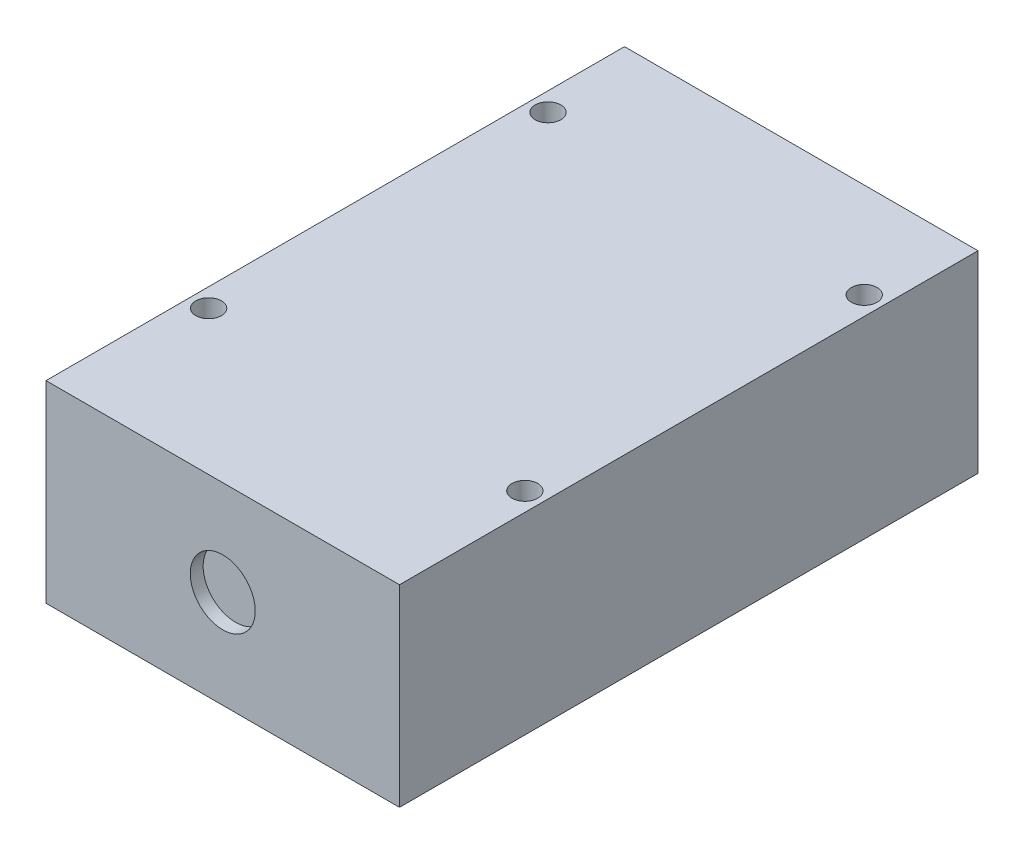
ISO-10303-21;
HEADER;
FILE_DESCRIPTION(('STEP AP214'),'2;1');
FILE_NAME('part.step','',(''),(''),'','','');
FILE_SCHEMA(('AUTOMOTIVE_DESIGN { 1 0 10303 214 1 1 1 1 }'));
ENDSEC;
DATA;
#1=APPLICATION_CONTEXT('core data for automotive mechanical design processes');
#2=APPLICATION_PROTOCOL_DEFINITION('international standard','automotive_design',2000,#1);
#3=PRODUCT_CONTEXT('',#1,'mechanical');
#4=PRODUCT('Part','Part','',(#3));
#5=PRODUCT_RELATED_PRODUCT_CATEGORY('part','',(#4));
#6=PRODUCT_DEFINITION_FORMATION('','',#4);
#7=PRODUCT_DEFINITION_CONTEXT('part definition',#1,'design');
#8=PRODUCT_DEFINITION('design','',#6,#7);
#9=PRODUCT_DEFINITION_SHAPE('','',#8);
#10=(LENGTH_UNIT() NAMED_UNIT(*) SI_UNIT(.MILLI.,.METRE.));
#11=(NAMED_UNIT(*) PLANE_ANGLE_UNIT() SI_UNIT($,.RADIAN.));
#12=(NAMED_UNIT(*) SI_UNIT($,.STERADIAN.) SOLID_ANGLE_UNIT());
#13=UNCERTAINTY_MEASURE_WITH_UNIT(LENGTH_MEASURE(1.E-05),#10,'distance_accuracy_value','');
#14=(GEOMETRIC_REPRESENTATION_CONTEXT(3) GLOBAL_UNCERTAINTY_ASSIGNED_CONTEXT((#13)) GLOBAL_UNIT_ASSIGNED_CONTEXT((#10,
#11,#12)) REPRESENTATION_CONTEXT('',''));
#15=CARTESIAN_POINT('',(0.,0.,0.));
#16=DIRECTION('',(0.,0.,1.));
#17=DIRECTION('',(1.,0.,0.));
#18=AXIS2_PLACEMENT_3D('',#15,#16,#17);
#19=CARTESIAN_POINT('',(0.,15.,0.));
#20=DIRECTION('',(0.,1.,0.));
#21=DIRECTION('',(0.,0.,1.));
#22=AXIS2_PLACEMENT_3D('',#19,#20,#21);
#23=PLANE('',#22);
#24=CARTESIAN_POINT('',(12.3,15.,11.3));
#25=DIRECTION('',(0.,1.,0.));
#26=DIRECTION('',(0.,0.,1.));
#27=AXIS2_PLACEMENT_3D('',#24,#25,#26);
#28=CIRCLE('',#27,1.);
#29=CARTESIAN_POINT('',(12.3,15.,12.3));
#30=VERTEX_POINT('',#29);
#31=EDGE_CURVE('E131',#30,#30,#28,.T.);
#32=ORIENTED_EDGE('',*,*,#31,.F.);
#33=EDGE_LOOP('',(#32));
#34=FACE_BOUND('',#33,.T.);
#35=CARTESIAN_POINT('',(-12.3,15.,-15.1));
#36=DIRECTION('',(0.,1.,0.));
#37=DIRECTION('',(0.,0.,1.));
#38=AXIS2_PLACEMENT_3D('',#35,#36,#37);
#39=CIRCLE('',#38,1.);
#40=CARTESIAN_POINT('',(-12.3,15.,-14.1));
#41=VERTEX_POINT('',#40);
#42=EDGE_CURVE('E110',#41,#41,#39,.T.);
#43=ORIENTED_EDGE('',*,*,#42,.F.);
#44=EDGE_LOOP('',(#43));
#45=FACE_BOUND('',#44,.T.);
#46=DIRECTION('',(0.,0.,-1.));
#47=VECTOR('',#46,1.);
#48=CARTESIAN_POINT('',(13.75,15.,-22.5));
#49=LINE('',#48,#47);
#50=CARTESIAN_POINT('',(13.75,15.,22.5));
#51=VERTEX_POINT('',#50);
#52=CARTESIAN_POINT('',(13.75,15.,-22.5));
#53=VERTEX_POINT('',#52);
#54=EDGE_CURVE('E95',#51,#53,#49,.T.);
#55=ORIENTED_EDGE('',*,*,#54,.T.);
#56=DIRECTION('',(-1.,0.,0.));
#57=VECTOR('',#56,1.);
#58=CARTESIAN_POINT('',(-13.75,15.,-22.5));
#59=LINE('',#58,#57);
#60=CARTESIAN_POINT('',(-13.75,15.,-22.5));
#61=VERTEX_POINT('',#60);
#62=EDGE_CURVE('E90',#53,#61,#59,.T.);
#63=ORIENTED_EDGE('',*,*,#62,.T.);
#64=DIRECTION('',(0.,0.,1.));
#65=VECTOR('',#64,1.);
#66=CARTESIAN_POINT('',(-13.75,15.,-22.5));
#67=LINE('',#66,#65);
#68=CARTESIAN_POINT('',(-13.75,15.,22.5));
#69=VERTEX_POINT('',#68);
#70=EDGE_CURVE('E93',#61,#69,#67,.T.);
#71=ORIENTED_EDGE('',*,*,#70,.T.);
#72=DIRECTION('',(1.,0.,0.));
#73=VECTOR('',#72,1.);
#74=CARTESIAN_POINT('',(-13.75,15.,22.5));
#75=LINE('',#74,#73);
#76=EDGE_CURVE('E60',#69,#51,#75,.T.);
#77=ORIENTED_EDGE('',*,*,#76,.T.);
#78=EDGE_LOOP('',(#55,#63,#71,#77));
#79=FACE_BOUND('',#78,.T.);
#80=CARTESIAN_POINT('',(12.3,15.,-15.1));
#81=DIRECTION('',(0.,1.,0.));
#82=DIRECTION('',(0.,0.,1.));
#83=AXIS2_PLACEMENT_3D('',#80,#81,#82);
#84=CIRCLE('',#83,1.);
#85=CARTESIAN_POINT('',(12.3,15.,-14.1));
#86=VERTEX_POINT('',#85);
#87=EDGE_CURVE('E125',#86,#86,#84,.T.);
#88=ORIENTED_EDGE('',*,*,#87,.F.);
#89=EDGE_LOOP('',(#88));
#90=FACE_BOUND('',#89,.T.);
#91=CARTESIAN_POINT('',(-12.3,15.,11.3));
#92=DIRECTION('',(0.,1.,0.));
#93=DIRECTION('',(0.,0.,1.));
#94=AXIS2_PLACEMENT_3D('',#91,#92,#93);
#95=CIRCLE('',#94,1.);
#96=CARTESIAN_POINT('',(-12.3,15.,12.3));
#97=VERTEX_POINT('',#96);
#98=EDGE_CURVE('E137',#97,#97,#95,.T.);
#99=ORIENTED_EDGE('',*,*,#98,.F.);
#100=EDGE_LOOP('',(#99));
#101=FACE_BOUND('',#100,.T.);
#102=ADVANCED_FACE('F43',(#34,#45,#79,#90,#101),#23,.T.);
#103=CARTESIAN_POINT('',(0.,0.,0.));
#104=DIRECTION('',(0.,1.,0.));
#105=DIRECTION('',(0.,0.,1.));
#106=AXIS2_PLACEMENT_3D('',#103,#104,#105);
#107=PLANE('',#106);
#108=DIRECTION('',(0.,0.,-1.));
#109=VECTOR('',#108,1.);
#110=CARTESIAN_POINT('',(13.75,0.,-22.5));
#111=LINE('',#110,#109);
#112=CARTESIAN_POINT('',(13.75,0.,22.5));
#113=VERTEX_POINT('',#112);
#114=CARTESIAN_POINT('',(13.75,0.,-22.5));
#115=VERTEX_POINT('',#114);
#116=EDGE_CURVE('E107',#113,#115,#111,.T.);
#117=ORIENTED_EDGE('',*,*,#116,.F.);
#118=DIRECTION('',(1.,0.,0.));
#119=VECTOR('',#118,1.);
#120=CARTESIAN_POINT('',(-13.75,0.,22.5));
#121=LINE('',#120,#119);
#122=CARTESIAN_POINT('',(-13.75,0.,22.5));
#123=VERTEX_POINT('',#122);
#124=EDGE_CURVE('E83',#123,#113,#121,.T.);
#125=ORIENTED_EDGE('',*,*,#124,.F.);
#126=DIRECTION('',(0.,0.,1.));
#127=VECTOR('',#126,1.);
#128=CARTESIAN_POINT('',(-13.75,0.,-22.5));
#129=LINE('',#128,#127);
#130=CARTESIAN_POINT('',(-13.75,0.,-22.5));
#131=VERTEX_POINT('',#130);
#132=EDGE_CURVE('E77',#131,#123,#129,.T.);
#133=ORIENTED_EDGE('',*,*,#132,.F.);
#134=DIRECTION('',(-1.,0.,0.));
#135=VECTOR('',#134,1.);
#136=CARTESIAN_POINT('',(-13.75,0.,-22.5));
#137=LINE('',#136,#135);
#138=EDGE_CURVE('E99',#115,#131,#137,.T.);
#139=ORIENTED_EDGE('',*,*,#138,.F.);
#140=EDGE_LOOP('',(#117,#125,#133,#139));
#141=FACE_BOUND('',#140,.T.);
#142=CARTESIAN_POINT('',(-12.3,0.,-15.1));
#143=DIRECTION('',(0.,1.,0.));
#144=DIRECTION('',(0.,0.,1.));
#145=AXIS2_PLACEMENT_3D('',#142,#143,#144);
#146=CIRCLE('',#145,1.);
#147=CARTESIAN_POINT('',(-12.3,0.,-14.1));
#148=VERTEX_POINT('',#147);
#149=EDGE_CURVE('E122',#148,#148,#146,.T.);
#150=ORIENTED_EDGE('',*,*,#149,.T.);
#151=EDGE_LOOP('',(#150));
#152=FACE_BOUND('',#151,.T.);
#153=CARTESIAN_POINT('',(12.3,0.,-15.1));
#154=DIRECTION('',(0.,1.,0.));
#155=DIRECTION('',(0.,0.,1.));
#156=AXIS2_PLACEMENT_3D('',#153,#154,#155);
#157=CIRCLE('',#156,1.);
#158=CARTESIAN_POINT('',(12.3,0.,-14.1));
#159=VERTEX_POINT('',#158);
#160=EDGE_CURVE('E128',#159,#159,#157,.T.);
#161=ORIENTED_EDGE('',*,*,#160,.T.);
#162=EDGE_LOOP('',(#161));
#163=FACE_BOUND('',#162,.T.);
#164=CARTESIAN_POINT('',(12.3,0.,11.3));
#165=DIRECTION('',(0.,1.,0.));
#166=DIRECTION('',(0.,0.,1.));
#167=AXIS2_PLACEMENT_3D('',#164,#165,#166);
#168=CIRCLE('',#167,1.);
#169=CARTESIAN_POINT('',(12.3,0.,12.3));
#170=VERTEX_POINT('',#169);
#171=EDGE_CURVE('E134',#170,#170,#168,.T.);
#172=ORIENTED_EDGE('',*,*,#171,.T.);
#173=EDGE_LOOP('',(#172));
#174=FACE_BOUND('',#173,.T.);
#175=CARTESIAN_POINT('',(-12.3,0.,11.3));
#176=DIRECTION('',(0.,1.,0.));
#177=DIRECTION('',(0.,0.,1.));
#178=AXIS2_PLACEMENT_3D('',#175,#176,#177);
#179=CIRCLE('',#178,1.);
#180=CARTESIAN_POINT('',(-12.3,0.,12.3));
#181=VERTEX_POINT('',#180);
#182=EDGE_CURVE('E140',#181,#181,#179,.T.);
#183=ORIENTED_EDGE('',*,*,#182,.T.);
#184=EDGE_LOOP('',(#183));
#185=FACE_BOUND('',#184,.T.);
#186=ADVANCED_FACE('F118',(#141,#152,#163,#174,#185),#107,.F.);
#187=CARTESIAN_POINT('',(13.75,15.,-22.5));
#188=DIRECTION('',(-1.,0.,0.));
#189=DIRECTION('',(0.,0.,1.));
#190=AXIS2_PLACEMENT_3D('',#187,#188,#189);
#191=PLANE('',#190);
#192=ORIENTED_EDGE('',*,*,#116,.T.);
#193=DIRECTION('',(0.,-1.,0.));
#194=VECTOR('',#193,1.);
#195=CARTESIAN_POINT('',(13.75,15.,-22.5));
#196=LINE('',#195,#194);
#197=EDGE_CURVE('E11',#53,#115,#196,.T.);
#198=ORIENTED_EDGE('',*,*,#197,.F.);
#199=ORIENTED_EDGE('',*,*,#54,.F.);
#200=DIRECTION('',(0.,-1.,0.));
#201=VECTOR('',#200,1.);
#202=CARTESIAN_POINT('',(13.75,15.,22.5));
#203=LINE('',#202,#201);
#204=EDGE_CURVE('E103',#51,#113,#203,.T.);
#205=ORIENTED_EDGE('',*,*,#204,.T.);
#206=EDGE_LOOP('',(#192,#198,#199,#205));
#207=FACE_BOUND('',#206,.T.);
#208=ADVANCED_FACE('F45',(#207),#191,.F.);
#209=CARTESIAN_POINT('',(-13.75,15.,-22.5));
#210=DIRECTION('',(0.,0.,1.));
#211=DIRECTION('',(1.,0.,0.));
#212=AXIS2_PLACEMENT_3D('',#209,#210,#211);
#213=PLANE('',#212);
#214=ORIENTED_EDGE('',*,*,#138,.T.);
#215=DIRECTION('',(0.,-1.,0.));
#216=VECTOR('',#215,1.);
#217=CARTESIAN_POINT('',(-13.75,15.,-22.5));
#218=LINE('',#217,#216);
#219=EDGE_CURVE('E52',#61,#131,#218,.T.);
#220=ORIENTED_EDGE('',*,*,#219,.F.);
#221=ORIENTED_EDGE('',*,*,#62,.F.);
#222=ORIENTED_EDGE('',*,*,#197,.T.);
#223=EDGE_LOOP('',(#214,#220,#221,#222));
#224=FACE_BOUND('',#223,.T.);
#225=ADVANCED_FACE('F98',(#224),#213,.F.);
#226=CARTESIAN_POINT('',(-13.75,15.,-22.5));
#227=DIRECTION('',(1.,0.,0.));
#228=DIRECTION('',(0.,0.,-1.));
#229=AXIS2_PLACEMENT_3D('',#226,#227,#228);
#230=PLANE('',#229);
#231=ORIENTED_EDGE('',*,*,#132,.T.);
#232=DIRECTION('',(0.,-1.,0.));
#233=VECTOR('',#232,1.);
#234=CARTESIAN_POINT('',(-13.75,15.,22.5));
#235=LINE('',#234,#233);
#236=EDGE_CURVE('E100',#69,#123,#235,.T.);
#237=ORIENTED_EDGE('',*,*,#236,.F.);
#238=ORIENTED_EDGE('',*,*,#70,.F.);
#239=ORIENTED_EDGE('',*,*,#219,.T.);
#240=EDGE_LOOP('',(#231,#237,#238,#239));
#241=FACE_BOUND('',#240,.T.);
#242=ADVANCED_FACE('F101',(#241),#230,.F.);
#243=CARTESIAN_POINT('',(-13.75,15.,22.5));
#244=DIRECTION('',(0.,0.,-1.));
#245=DIRECTION('',(-1.,0.,0.));
#246=AXIS2_PLACEMENT_3D('',#243,#244,#245);
#247=PLANE('',#246);
#248=CARTESIAN_POINT('',(0.,7.61486871513089,22.5));
#249=DIRECTION('',(0.,0.,1.));
#250=DIRECTION('',(1.,0.,0.));
#251=AXIS2_PLACEMENT_3D('',#248,#249,#250);
#252=CIRCLE('',#251,2.52645656466927);
#253=CARTESIAN_POINT('',(2.52645656466927,7.61486871513089,22.5));
#254=VERTEX_POINT('',#253);
#255=EDGE_CURVE('E146',#254,#254,#252,.T.);
#256=ORIENTED_EDGE('',*,*,#255,.F.);
#257=EDGE_LOOP('',(#256));
#258=FACE_BOUND('',#257,.T.);
#259=ORIENTED_EDGE('',*,*,#124,.T.);
#260=ORIENTED_EDGE('',*,*,#204,.F.);
#261=ORIENTED_EDGE('',*,*,#76,.F.);
#262=ORIENTED_EDGE('',*,*,#236,.T.);
#263=EDGE_LOOP('',(#259,#260,#261,#262));
#264=FACE_BOUND('',#263,.T.);
#265=ADVANCED_FACE('F115',(#258,#264),#247,.F.);
#266=CARTESIAN_POINT('',(-12.3,15.,-15.1));
#267=DIRECTION('',(0.,-1.,0.));
#268=DIRECTION('',(0.,0.,-1.));
#269=AXIS2_PLACEMENT_3D('',#266,#267,#268);
#270=CYLINDRICAL_SURFACE('',#269,1.);
#271=ORIENTED_EDGE('',*,*,#42,.T.);
#272=EDGE_LOOP('',(#271));
#273=FACE_BOUND('',#272,.T.);
#274=ORIENTED_EDGE('',*,*,#149,.F.);
#275=EDGE_LOOP('',(#274));
#276=FACE_BOUND('',#275,.T.);
#277=ADVANCED_FACE('F162',(#273,#276),#270,.F.);
#278=CARTESIAN_POINT('',(12.3,15.,-15.1));
#279=DIRECTION('',(0.,-1.,0.));
#280=DIRECTION('',(0.,0.,-1.));
#281=AXIS2_PLACEMENT_3D('',#278,#279,#280);
#282=CYLINDRICAL_SURFACE('',#281,1.);
#283=ORIENTED_EDGE('',*,*,#87,.T.);
#284=EDGE_LOOP('',(#283));
#285=FACE_BOUND('',#284,.T.);
#286=ORIENTED_EDGE('',*,*,#160,.F.);
#287=EDGE_LOOP('',(#286));
#288=FACE_BOUND('',#287,.T.);
#289=ADVANCED_FACE('F168',(#285,#288),#282,.F.);
#290=CARTESIAN_POINT('',(12.3,15.,11.3));
#291=DIRECTION('',(0.,-1.,0.));
#292=DIRECTION('',(0.,0.,-1.));
#293=AXIS2_PLACEMENT_3D('',#290,#291,#292);
#294=CYLINDRICAL_SURFACE('',#293,1.);
#295=ORIENTED_EDGE('',*,*,#31,.T.);
#296=EDGE_LOOP('',(#295));
#297=FACE_BOUND('',#296,.T.);
#298=ORIENTED_EDGE('',*,*,#171,.F.);
#299=EDGE_LOOP('',(#298));
#300=FACE_BOUND('',#299,.T.);
#301=ADVANCED_FACE('F185',(#297,#300),#294,.F.);
#302=CARTESIAN_POINT('',(-12.3,15.,11.3));
#303=DIRECTION('',(0.,-1.,0.));
#304=DIRECTION('',(0.,0.,-1.));
#305=AXIS2_PLACEMENT_3D('',#302,#303,#304);
#306=CYLINDRICAL_SURFACE('',#305,1.);
#307=ORIENTED_EDGE('',*,*,#98,.T.);
#308=EDGE_LOOP('',(#307));
#309=FACE_BOUND('',#308,.T.);
#310=ORIENTED_EDGE('',*,*,#182,.F.);
#311=EDGE_LOOP('',(#310));
#312=FACE_BOUND('',#311,.T.);
#313=ADVANCED_FACE('F157',(#309,#312),#306,.F.);
#314=CARTESIAN_POINT('',(0.,7.61486871513089,21.5));
#315=DIRECTION('',(0.,0.,1.));
#316=DIRECTION('',(1.,0.,0.));
#317=AXIS2_PLACEMENT_3D('',#314,#315,#316);
#318=CYLINDRICAL_SURFACE('',#317,2.52645656466927);
#319=CARTESIAN_POINT('',(0.,7.61486871513089,21.5));
#320=DIRECTION('',(0.,0.,1.));
#321=DIRECTION('',(1.,0.,0.));
#322=AXIS2_PLACEMENT_3D('',#319,#320,#321);
#323=CIRCLE('',#322,2.52645656466927);
#324=CARTESIAN_POINT('',(2.52645656466927,7.61486871513089,21.5));
#325=VERTEX_POINT('',#324);
#326=EDGE_CURVE('E143',#325,#325,#323,.T.);
#327=ORIENTED_EDGE('',*,*,#326,.F.);
#328=EDGE_LOOP('',(#327));
#329=FACE_BOUND('',#328,.T.);
#330=ORIENTED_EDGE('',*,*,#255,.T.);
#331=EDGE_LOOP('',(#330));
#332=FACE_BOUND('',#331,.T.);
#333=ADVANCED_FACE('F154',(#329,#332),#318,.F.);
#334=CARTESIAN_POINT('',(0.,7.61486871513089,21.5));
#335=DIRECTION('',(0.,0.,1.));
#336=DIRECTION('',(1.,0.,0.));
#337=AXIS2_PLACEMENT_3D('',#334,#335,#336);
#338=PLANE('',#337);
#339=ORIENTED_EDGE('',*,*,#326,.T.);
#340=EDGE_LOOP('',(#339));
#341=FACE_BOUND('',#340,.T.);
#342=ADVANCED_FACE('F152',(#341),#338,.T.);
#343=CLOSED_SHELL('',(#102,#186,#208,#225,#242,#265,#277,#289,#301,#313,#333,#342));
#344=MANIFOLD_SOLID_BREP('B2',#343);
#345=ADVANCED_BREP_SHAPE_REPRESENTATION('',(#18,#344),#14);
#346=SHAPE_DEFINITION_REPRESENTATION(#9,#345);
ENDSEC;
END-ISO-10303-21;
